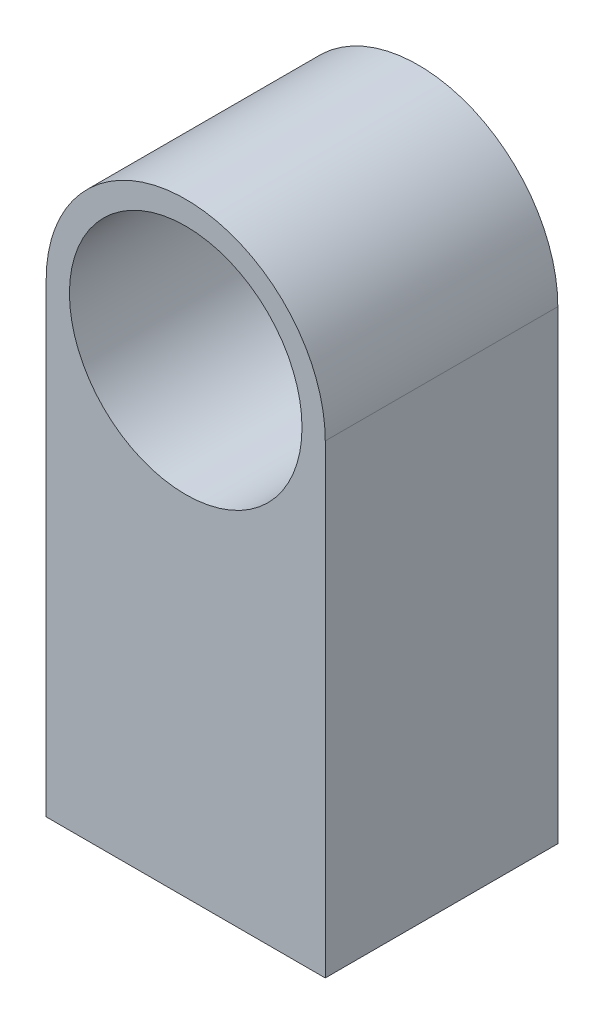
ISO-10303-21;
HEADER;
FILE_DESCRIPTION(('STEP AP214'),'2;1');
FILE_NAME('part.step','',(''),(''),'','','');
FILE_SCHEMA(('AUTOMOTIVE_DESIGN { 1 0 10303 214 1 1 1 1 }'));
ENDSEC;
DATA;
#1=APPLICATION_CONTEXT('core data for automotive mechanical design processes');
#2=APPLICATION_PROTOCOL_DEFINITION('international standard','automotive_design',2000,#1);
#3=PRODUCT_CONTEXT('',#1,'mechanical');
#4=PRODUCT('Part','Part','',(#3));
#5=PRODUCT_RELATED_PRODUCT_CATEGORY('part','',(#4));
#6=PRODUCT_DEFINITION_FORMATION('','',#4);
#7=PRODUCT_DEFINITION_CONTEXT('part definition',#1,'design');
#8=PRODUCT_DEFINITION('design','',#6,#7);
#9=PRODUCT_DEFINITION_SHAPE('','',#8);
#10=(LENGTH_UNIT() NAMED_UNIT(*) SI_UNIT(.MILLI.,.METRE.));
#11=(NAMED_UNIT(*) PLANE_ANGLE_UNIT() SI_UNIT($,.RADIAN.));
#12=(NAMED_UNIT(*) SI_UNIT($,.STERADIAN.) SOLID_ANGLE_UNIT());
#13=UNCERTAINTY_MEASURE_WITH_UNIT(LENGTH_MEASURE(1.E-05),#10,'distance_accuracy_value','');
#14=(GEOMETRIC_REPRESENTATION_CONTEXT(3) GLOBAL_UNCERTAINTY_ASSIGNED_CONTEXT((#13)) GLOBAL_UNIT_ASSIGNED_CONTEXT((#10,
#11,#12)) REPRESENTATION_CONTEXT('',''));
#15=CARTESIAN_POINT('',(0.,0.,0.));
#16=DIRECTION('',(0.,0.,1.));
#17=DIRECTION('',(1.,0.,0.));
#18=AXIS2_PLACEMENT_3D('',#15,#16,#17);
#19=CARTESIAN_POINT('',(8.73786407766986,98.0582524271845,100.));
#20=DIRECTION('',(0.,0.,-1.));
#21=DIRECTION('',(-1.,0.,0.));
#22=AXIS2_PLACEMENT_3D('',#19,#20,#21);
#23=PLANE('',#22);
#24=CARTESIAN_POINT('',(8.73786407766986,98.0582524271845,100.));
#25=DIRECTION('',(0.,0.,1.));
#26=DIRECTION('',(-1.,0.,0.));
#27=AXIS2_PLACEMENT_3D('',#24,#25,#26);
#28=CIRCLE('',#27,60.);
#29=CARTESIAN_POINT('',(68.7378640776699,98.0582524271845,100.));
#30=VERTEX_POINT('',#29);
#31=CARTESIAN_POINT('',(-51.2621359223301,98.0582524271845,100.));
#32=VERTEX_POINT('',#31);
#33=EDGE_CURVE('E91',#30,#32,#28,.T.);
#34=ORIENTED_EDGE('',*,*,#33,.T.);
#35=DIRECTION('',(0.,-1.,0.));
#36=VECTOR('',#35,1.);
#37=CARTESIAN_POINT('',(-51.2621359223301,98.0582524271845,100.));
#38=LINE('',#37,#36);
#39=CARTESIAN_POINT('',(-51.2621359223301,-101.941747572816,100.));
#40=VERTEX_POINT('',#39);
#41=EDGE_CURVE('E86',#32,#40,#38,.T.);
#42=ORIENTED_EDGE('',*,*,#41,.T.);
#43=DIRECTION('',(1.,0.,0.));
#44=VECTOR('',#43,1.);
#45=CARTESIAN_POINT('',(-51.2621359223301,-101.941747572816,100.));
#46=LINE('',#45,#44);
#47=CARTESIAN_POINT('',(68.7378640776699,-101.941747572816,100.));
#48=VERTEX_POINT('',#47);
#49=EDGE_CURVE('E89',#40,#48,#46,.T.);
#50=ORIENTED_EDGE('',*,*,#49,.T.);
#51=DIRECTION('',(0.,1.,0.));
#52=VECTOR('',#51,1.);
#53=CARTESIAN_POINT('',(68.7378640776699,98.0582524271845,100.));
#54=LINE('',#53,#52);
#55=EDGE_CURVE('E56',#48,#30,#54,.T.);
#56=ORIENTED_EDGE('',*,*,#55,.T.);
#57=EDGE_LOOP('',(#34,#42,#50,#56));
#58=FACE_BOUND('',#57,.T.);
#59=CARTESIAN_POINT('',(8.73786407766986,98.0582524271845,100.));
#60=DIRECTION('',(0.,0.,1.));
#61=DIRECTION('',(1.,0.,0.));
#62=AXIS2_PLACEMENT_3D('',#59,#60,#61);
#63=CIRCLE('',#62,50.);
#64=CARTESIAN_POINT('',(58.7378640776699,98.0582524271845,100.));
#65=VERTEX_POINT('',#64);
#66=EDGE_CURVE('E106',#65,#65,#63,.T.);
#67=ORIENTED_EDGE('',*,*,#66,.F.);
#68=EDGE_LOOP('',(#67));
#69=FACE_BOUND('',#68,.T.);
#70=ADVANCED_FACE('F39',(#58,#69),#23,.F.);
#71=CARTESIAN_POINT('',(8.73786407766986,98.0582524271845,0.));
#72=DIRECTION('',(0.,0.,-1.));
#73=DIRECTION('',(-1.,0.,0.));
#74=AXIS2_PLACEMENT_3D('',#71,#72,#73);
#75=PLANE('',#74);
#76=CARTESIAN_POINT('',(8.73786407766986,98.0582524271845,0.));
#77=DIRECTION('',(0.,0.,1.));
#78=DIRECTION('',(-1.,0.,0.));
#79=AXIS2_PLACEMENT_3D('',#76,#77,#78);
#80=CIRCLE('',#79,60.);
#81=CARTESIAN_POINT('',(68.7378640776699,98.0582524271845,0.));
#82=VERTEX_POINT('',#81);
#83=CARTESIAN_POINT('',(-51.2621359223301,98.0582524271845,0.));
#84=VERTEX_POINT('',#83);
#85=EDGE_CURVE('E103',#82,#84,#80,.T.);
#86=ORIENTED_EDGE('',*,*,#85,.F.);
#87=DIRECTION('',(0.,1.,0.));
#88=VECTOR('',#87,1.);
#89=CARTESIAN_POINT('',(68.7378640776699,98.0582524271845,0.));
#90=LINE('',#89,#88);
#91=CARTESIAN_POINT('',(68.7378640776699,-101.941747572816,0.));
#92=VERTEX_POINT('',#91);
#93=EDGE_CURVE('E79',#92,#82,#90,.T.);
#94=ORIENTED_EDGE('',*,*,#93,.F.);
#95=DIRECTION('',(1.,0.,0.));
#96=VECTOR('',#95,1.);
#97=CARTESIAN_POINT('',(-51.2621359223301,-101.941747572816,0.));
#98=LINE('',#97,#96);
#99=CARTESIAN_POINT('',(-51.2621359223301,-101.941747572816,0.));
#100=VERTEX_POINT('',#99);
#101=EDGE_CURVE('E73',#100,#92,#98,.T.);
#102=ORIENTED_EDGE('',*,*,#101,.F.);
#103=DIRECTION('',(0.,-1.,0.));
#104=VECTOR('',#103,1.);
#105=CARTESIAN_POINT('',(-51.2621359223301,98.0582524271845,0.));
#106=LINE('',#105,#104);
#107=EDGE_CURVE('E95',#84,#100,#106,.T.);
#108=ORIENTED_EDGE('',*,*,#107,.F.);
#109=EDGE_LOOP('',(#86,#94,#102,#108));
#110=FACE_BOUND('',#109,.T.);
#111=CARTESIAN_POINT('',(8.73786407766986,98.0582524271845,0.));
#112=DIRECTION('',(0.,0.,1.));
#113=DIRECTION('',(1.,0.,0.));
#114=AXIS2_PLACEMENT_3D('',#111,#112,#113);
#115=CIRCLE('',#114,50.);
#116=CARTESIAN_POINT('',(58.7378640776699,98.0582524271845,0.));
#117=VERTEX_POINT('',#116);
#118=EDGE_CURVE('E118',#117,#117,#115,.T.);
#119=ORIENTED_EDGE('',*,*,#118,.T.);
#120=EDGE_LOOP('',(#119));
#121=FACE_BOUND('',#120,.T.);
#122=ADVANCED_FACE('F114',(#110,#121),#75,.T.);
#123=CARTESIAN_POINT('',(8.73786407766986,98.0582524271845,100.));
#124=DIRECTION('',(0.,0.,-1.));
#125=DIRECTION('',(-1.,0.,0.));
#126=AXIS2_PLACEMENT_3D('',#123,#124,#125);
#127=CYLINDRICAL_SURFACE('',#126,60.);
#128=ORIENTED_EDGE('',*,*,#85,.T.);
#129=DIRECTION('',(0.,0.,-1.));
#130=VECTOR('',#129,1.);
#131=CARTESIAN_POINT('',(-51.2621359223301,98.0582524271845,100.));
#132=LINE('',#131,#130);
#133=EDGE_CURVE('E11',#32,#84,#132,.T.);
#134=ORIENTED_EDGE('',*,*,#133,.F.);
#135=ORIENTED_EDGE('',*,*,#33,.F.);
#136=DIRECTION('',(0.,0.,-1.));
#137=VECTOR('',#136,1.);
#138=CARTESIAN_POINT('',(68.7378640776699,98.0582524271845,100.));
#139=LINE('',#138,#137);
#140=EDGE_CURVE('E99',#30,#82,#139,.T.);
#141=ORIENTED_EDGE('',*,*,#140,.T.);
#142=EDGE_LOOP('',(#128,#134,#135,#141));
#143=FACE_BOUND('',#142,.T.);
#144=ADVANCED_FACE('F41',(#143),#127,.T.);
#145=CARTESIAN_POINT('',(-51.2621359223301,98.0582524271845,100.));
#146=DIRECTION('',(1.,0.,0.));
#147=DIRECTION('',(0.,1.,0.));
#148=AXIS2_PLACEMENT_3D('',#145,#146,#147);
#149=PLANE('',#148);
#150=ORIENTED_EDGE('',*,*,#107,.T.);
#151=DIRECTION('',(0.,0.,-1.));
#152=VECTOR('',#151,1.);
#153=CARTESIAN_POINT('',(-51.2621359223301,-101.941747572816,100.));
#154=LINE('',#153,#152);
#155=EDGE_CURVE('E48',#40,#100,#154,.T.);
#156=ORIENTED_EDGE('',*,*,#155,.F.);
#157=ORIENTED_EDGE('',*,*,#41,.F.);
#158=ORIENTED_EDGE('',*,*,#133,.T.);
#159=EDGE_LOOP('',(#150,#156,#157,#158));
#160=FACE_BOUND('',#159,.T.);
#161=ADVANCED_FACE('F94',(#160),#149,.F.);
#162=CARTESIAN_POINT('',(-51.2621359223301,-101.941747572816,100.));
#163=DIRECTION('',(0.,1.,0.));
#164=DIRECTION('',(0.,0.,1.));
#165=AXIS2_PLACEMENT_3D('',#162,#163,#164);
#166=PLANE('',#165);
#167=CARTESIAN_POINT('',(8.7378640776699,-101.941747572816,52.248339218776));
#168=DIRECTION('',(0.,-1.,0.));
#169=DIRECTION('',(0.,0.,-1.));
#170=AXIS2_PLACEMENT_3D('',#167,#168,#169);
#171=CIRCLE('',#170,6.69303861443788);
#172=CARTESIAN_POINT('',(8.7378640776699,-101.941747572816,45.5553006043381));
#173=VERTEX_POINT('',#172);
#174=EDGE_CURVE('E124',#173,#173,#171,.T.);
#175=ORIENTED_EDGE('',*,*,#174,.F.);
#176=EDGE_LOOP('',(#175));
#177=FACE_BOUND('',#176,.T.);
#178=ORIENTED_EDGE('',*,*,#101,.T.);
#179=DIRECTION('',(0.,0.,-1.));
#180=VECTOR('',#179,1.);
#181=CARTESIAN_POINT('',(68.7378640776699,-101.941747572816,100.));
#182=LINE('',#181,#180);
#183=EDGE_CURVE('E96',#48,#92,#182,.T.);
#184=ORIENTED_EDGE('',*,*,#183,.F.);
#185=ORIENTED_EDGE('',*,*,#49,.F.);
#186=ORIENTED_EDGE('',*,*,#155,.T.);
#187=EDGE_LOOP('',(#178,#184,#185,#186));
#188=FACE_BOUND('',#187,.T.);
#189=ADVANCED_FACE('F97',(#177,#188),#166,.F.);
#190=CARTESIAN_POINT('',(68.7378640776699,98.0582524271845,100.));
#191=DIRECTION('',(-1.,0.,0.));
#192=DIRECTION('',(0.,-1.,0.));
#193=AXIS2_PLACEMENT_3D('',#190,#191,#192);
#194=PLANE('',#193);
#195=ORIENTED_EDGE('',*,*,#93,.T.);
#196=ORIENTED_EDGE('',*,*,#140,.F.);
#197=ORIENTED_EDGE('',*,*,#55,.F.);
#198=ORIENTED_EDGE('',*,*,#183,.T.);
#199=EDGE_LOOP('',(#195,#196,#197,#198));
#200=FACE_BOUND('',#199,.T.);
#201=ADVANCED_FACE('F111',(#200),#194,.F.);
#202=CARTESIAN_POINT('',(8.73786407766986,98.0582524271845,100.));
#203=DIRECTION('',(0.,0.,-1.));
#204=DIRECTION('',(-1.,0.,0.));
#205=AXIS2_PLACEMENT_3D('',#202,#203,#204);
#206=CYLINDRICAL_SURFACE('',#205,50.);
#207=ORIENTED_EDGE('',*,*,#66,.T.);
#208=EDGE_LOOP('',(#207));
#209=FACE_BOUND('',#208,.T.);
#210=ORIENTED_EDGE('',*,*,#118,.F.);
#211=EDGE_LOOP('',(#210));
#212=FACE_BOUND('',#211,.T.);
#213=ADVANCED_FACE('F135',(#209,#212),#206,.F.);
#214=CARTESIAN_POINT('',(8.7378640776699,-96.9417475728155,52.248339218776));
#215=DIRECTION('',(0.,-1.,0.));
#216=DIRECTION('',(0.,0.,-1.));
#217=AXIS2_PLACEMENT_3D('',#214,#215,#216);
#218=CYLINDRICAL_SURFACE('',#217,6.69303861443788);
#219=CARTESIAN_POINT('',(8.7378640776699,-96.9417475728155,52.248339218776));
#220=DIRECTION('',(0.,-1.,0.));
#221=DIRECTION('',(0.,0.,-1.));
#222=AXIS2_PLACEMENT_3D('',#219,#220,#221);
#223=CIRCLE('',#222,6.69303861443788);
#224=CARTESIAN_POINT('',(8.7378640776699,-96.9417475728155,45.5553006043381));
#225=VERTEX_POINT('',#224);
#226=EDGE_CURVE('E121',#225,#225,#223,.T.);
#227=ORIENTED_EDGE('',*,*,#226,.F.);
#228=EDGE_LOOP('',(#227));
#229=FACE_BOUND('',#228,.T.);
#230=ORIENTED_EDGE('',*,*,#174,.T.);
#231=EDGE_LOOP('',(#230));
#232=FACE_BOUND('',#231,.T.);
#233=ADVANCED_FACE('F132',(#229,#232),#218,.F.);
#234=CARTESIAN_POINT('',(8.7378640776699,-96.9417475728155,52.248339218776));
#235=DIRECTION('',(0.,-1.,0.));
#236=DIRECTION('',(0.,0.,-1.));
#237=AXIS2_PLACEMENT_3D('',#234,#235,#236);
#238=PLANE('',#237);
#239=ORIENTED_EDGE('',*,*,#226,.T.);
#240=EDGE_LOOP('',(#239));
#241=FACE_BOUND('',#240,.T.);
#242=ADVANCED_FACE('F130',(#241),#238,.T.);
#243=CLOSED_SHELL('',(#70,#122,#144,#161,#189,#201,#213,#233,#242));
#244=MANIFOLD_SOLID_BREP('B2',#243);
#245=ADVANCED_BREP_SHAPE_REPRESENTATION('',(#18,#244),#14);
#246=SHAPE_DEFINITION_REPRESENTATION(#9,#245);
ENDSEC;
END-ISO-10303-21;
